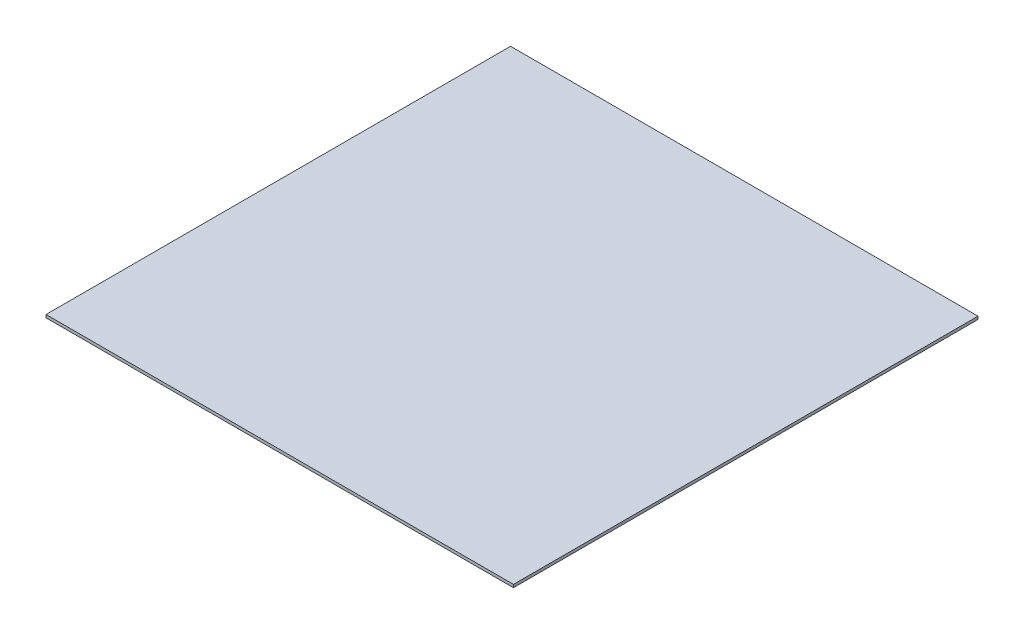
ISO-10303-21;
HEADER;
FILE_DESCRIPTION(('STEP AP214'),'2;1');
FILE_NAME('part.step','',(''),(''),'','','');
FILE_SCHEMA(('AUTOMOTIVE_DESIGN { 1 0 10303 214 1 1 1 1 }'));
ENDSEC;
DATA;
#1=APPLICATION_CONTEXT('core data for automotive mechanical design processes');
#2=APPLICATION_PROTOCOL_DEFINITION('international standard','automotive_design',2000,#1);
#3=PRODUCT_CONTEXT('',#1,'mechanical');
#4=PRODUCT('Part','Part','',(#3));
#5=PRODUCT_RELATED_PRODUCT_CATEGORY('part','',(#4));
#6=PRODUCT_DEFINITION_FORMATION('','',#4);
#7=PRODUCT_DEFINITION_CONTEXT('part definition',#1,'design');
#8=PRODUCT_DEFINITION('design','',#6,#7);
#9=PRODUCT_DEFINITION_SHAPE('','',#8);
#10=(LENGTH_UNIT() NAMED_UNIT(*) SI_UNIT(.MILLI.,.METRE.));
#11=(NAMED_UNIT(*) PLANE_ANGLE_UNIT() SI_UNIT($,.RADIAN.));
#12=(NAMED_UNIT(*) SI_UNIT($,.STERADIAN.) SOLID_ANGLE_UNIT());
#13=UNCERTAINTY_MEASURE_WITH_UNIT(LENGTH_MEASURE(1.E-05),#10,'distance_accuracy_value','');
#14=(GEOMETRIC_REPRESENTATION_CONTEXT(3) GLOBAL_UNCERTAINTY_ASSIGNED_CONTEXT((#13)) GLOBAL_UNIT_ASSIGNED_CONTEXT((#10,
#11,#12)) REPRESENTATION_CONTEXT('',''));
#15=CARTESIAN_POINT('',(0.,0.,0.));
#16=DIRECTION('',(0.,0.,1.));
#17=DIRECTION('',(1.,0.,0.));
#18=AXIS2_PLACEMENT_3D('',#15,#16,#17);
#19=CARTESIAN_POINT('',(402.5,5.,-400.));
#20=DIRECTION('',(-1.,0.,0.));
#21=DIRECTION('',(0.,0.,1.));
#22=AXIS2_PLACEMENT_3D('',#19,#20,#21);
#23=PLANE('',#22);
#24=DIRECTION('',(0.,0.,-1.));
#25=VECTOR('',#24,1.);
#26=CARTESIAN_POINT('',(402.5,0.,-400.));
#27=LINE('',#26,#25);
#28=CARTESIAN_POINT('',(402.5,0.,400.));
#29=VERTEX_POINT('',#28);
#30=CARTESIAN_POINT('',(402.5,0.,-400.));
#31=VERTEX_POINT('',#30);
#32=EDGE_CURVE('E96',#29,#31,#27,.T.);
#33=ORIENTED_EDGE('',*,*,#32,.T.);
#34=DIRECTION('',(0.,-1.,0.));
#35=VECTOR('',#34,1.);
#36=CARTESIAN_POINT('',(402.5,5.,-400.));
#37=LINE('',#36,#35);
#38=CARTESIAN_POINT('',(402.5,5.,-400.));
#39=VERTEX_POINT('',#38);
#40=EDGE_CURVE('E11',#39,#31,#37,.T.);
#41=ORIENTED_EDGE('',*,*,#40,.F.);
#42=DIRECTION('',(0.,0.,-1.));
#43=VECTOR('',#42,1.);
#44=CARTESIAN_POINT('',(402.5,5.,-400.));
#45=LINE('',#44,#43);
#46=CARTESIAN_POINT('',(402.5,5.,400.));
#47=VERTEX_POINT('',#46);
#48=EDGE_CURVE('E84',#47,#39,#45,.T.);
#49=ORIENTED_EDGE('',*,*,#48,.F.);
#50=DIRECTION('',(0.,-1.,0.));
#51=VECTOR('',#50,1.);
#52=CARTESIAN_POINT('',(402.5,5.,400.));
#53=LINE('',#52,#51);
#54=EDGE_CURVE('E92',#47,#29,#53,.T.);
#55=ORIENTED_EDGE('',*,*,#54,.T.);
#56=EDGE_LOOP('',(#33,#41,#49,#55));
#57=FACE_BOUND('',#56,.T.);
#58=ADVANCED_FACE('F33',(#57),#23,.F.);
#59=CARTESIAN_POINT('',(-402.5,5.,-400.));
#60=DIRECTION('',(0.,0.,1.));
#61=DIRECTION('',(1.,0.,0.));
#62=AXIS2_PLACEMENT_3D('',#59,#60,#61);
#63=PLANE('',#62);
#64=DIRECTION('',(-1.,0.,0.));
#65=VECTOR('',#64,1.);
#66=CARTESIAN_POINT('',(-402.5,0.,-400.));
#67=LINE('',#66,#65);
#68=CARTESIAN_POINT('',(-402.5,0.,-400.));
#69=VERTEX_POINT('',#68);
#70=EDGE_CURVE('E88',#31,#69,#67,.T.);
#71=ORIENTED_EDGE('',*,*,#70,.T.);
#72=DIRECTION('',(0.,-1.,0.));
#73=VECTOR('',#72,1.);
#74=CARTESIAN_POINT('',(-402.5,5.,-400.));
#75=LINE('',#74,#73);
#76=CARTESIAN_POINT('',(-402.5,5.,-400.));
#77=VERTEX_POINT('',#76);
#78=EDGE_CURVE('E41',#77,#69,#75,.T.);
#79=ORIENTED_EDGE('',*,*,#78,.F.);
#80=DIRECTION('',(-1.,0.,0.));
#81=VECTOR('',#80,1.);
#82=CARTESIAN_POINT('',(-402.5,5.,-400.));
#83=LINE('',#82,#81);
#84=EDGE_CURVE('E79',#39,#77,#83,.T.);
#85=ORIENTED_EDGE('',*,*,#84,.F.);
#86=ORIENTED_EDGE('',*,*,#40,.T.);
#87=EDGE_LOOP('',(#71,#79,#85,#86));
#88=FACE_BOUND('',#87,.T.);
#89=ADVANCED_FACE('F87',(#88),#63,.F.);
#90=CARTESIAN_POINT('',(-402.5,5.,-400.));
#91=DIRECTION('',(1.,0.,0.));
#92=DIRECTION('',(0.,0.,-1.));
#93=AXIS2_PLACEMENT_3D('',#90,#91,#92);
#94=PLANE('',#93);
#95=DIRECTION('',(0.,0.,1.));
#96=VECTOR('',#95,1.);
#97=CARTESIAN_POINT('',(-402.5,0.,-400.));
#98=LINE('',#97,#96);
#99=CARTESIAN_POINT('',(-402.5,0.,400.));
#100=VERTEX_POINT('',#99);
#101=EDGE_CURVE('E66',#69,#100,#98,.T.);
#102=ORIENTED_EDGE('',*,*,#101,.T.);
#103=DIRECTION('',(0.,-1.,0.));
#104=VECTOR('',#103,1.);
#105=CARTESIAN_POINT('',(-402.5,5.,400.));
#106=LINE('',#105,#104);
#107=CARTESIAN_POINT('',(-402.5,5.,400.));
#108=VERTEX_POINT('',#107);
#109=EDGE_CURVE('E89',#108,#100,#106,.T.);
#110=ORIENTED_EDGE('',*,*,#109,.F.);
#111=DIRECTION('',(0.,0.,1.));
#112=VECTOR('',#111,1.);
#113=CARTESIAN_POINT('',(-402.5,5.,-400.));
#114=LINE('',#113,#112);
#115=EDGE_CURVE('E82',#77,#108,#114,.T.);
#116=ORIENTED_EDGE('',*,*,#115,.F.);
#117=ORIENTED_EDGE('',*,*,#78,.T.);
#118=EDGE_LOOP('',(#102,#110,#116,#117));
#119=FACE_BOUND('',#118,.T.);
#120=ADVANCED_FACE('F90',(#119),#94,.F.);
#121=CARTESIAN_POINT('',(-402.5,5.,400.));
#122=DIRECTION('',(0.,0.,-1.));
#123=DIRECTION('',(-1.,0.,0.));
#124=AXIS2_PLACEMENT_3D('',#121,#122,#123);
#125=PLANE('',#124);
#126=DIRECTION('',(1.,0.,0.));
#127=VECTOR('',#126,1.);
#128=CARTESIAN_POINT('',(-402.5,0.,400.));
#129=LINE('',#128,#127);
#130=EDGE_CURVE('E72',#100,#29,#129,.T.);
#131=ORIENTED_EDGE('',*,*,#130,.T.);
#132=ORIENTED_EDGE('',*,*,#54,.F.);
#133=DIRECTION('',(1.,0.,0.));
#134=VECTOR('',#133,1.);
#135=CARTESIAN_POINT('',(-402.5,5.,400.));
#136=LINE('',#135,#134);
#137=EDGE_CURVE('E49',#108,#47,#136,.T.);
#138=ORIENTED_EDGE('',*,*,#137,.F.);
#139=ORIENTED_EDGE('',*,*,#109,.T.);
#140=EDGE_LOOP('',(#131,#132,#138,#139));
#141=FACE_BOUND('',#140,.T.);
#142=ADVANCED_FACE('F103',(#141),#125,.F.);
#143=CARTESIAN_POINT('',(0.,5.,0.));
#144=DIRECTION('',(0.,1.,0.));
#145=DIRECTION('',(0.,0.,1.));
#146=AXIS2_PLACEMENT_3D('',#143,#144,#145);
#147=PLANE('',#146);
#148=ORIENTED_EDGE('',*,*,#48,.T.);
#149=ORIENTED_EDGE('',*,*,#84,.T.);
#150=ORIENTED_EDGE('',*,*,#115,.T.);
#151=ORIENTED_EDGE('',*,*,#137,.T.);
#152=EDGE_LOOP('',(#148,#149,#150,#151));
#153=FACE_BOUND('',#152,.T.);
#154=ADVANCED_FACE('F80',(#153),#147,.T.);
#155=CARTESIAN_POINT('',(0.,0.,0.));
#156=DIRECTION('',(0.,1.,0.));
#157=DIRECTION('',(0.,0.,1.));
#158=AXIS2_PLACEMENT_3D('',#155,#156,#157);
#159=PLANE('',#158);
#160=ORIENTED_EDGE('',*,*,#32,.F.);
#161=ORIENTED_EDGE('',*,*,#130,.F.);
#162=ORIENTED_EDGE('',*,*,#101,.F.);
#163=ORIENTED_EDGE('',*,*,#70,.F.);
#164=EDGE_LOOP('',(#160,#161,#162,#163));
#165=FACE_BOUND('',#164,.T.);
#166=ADVANCED_FACE('F106',(#165),#159,.F.);
#167=CLOSED_SHELL('',(#58,#89,#120,#142,#154,#166));
#168=MANIFOLD_SOLID_BREP('B2',#167);
#169=ADVANCED_BREP_SHAPE_REPRESENTATION('',(#18,#168),#14);
#170=SHAPE_DEFINITION_REPRESENTATION(#9,#169);
ENDSEC;
END-ISO-10303-21;
